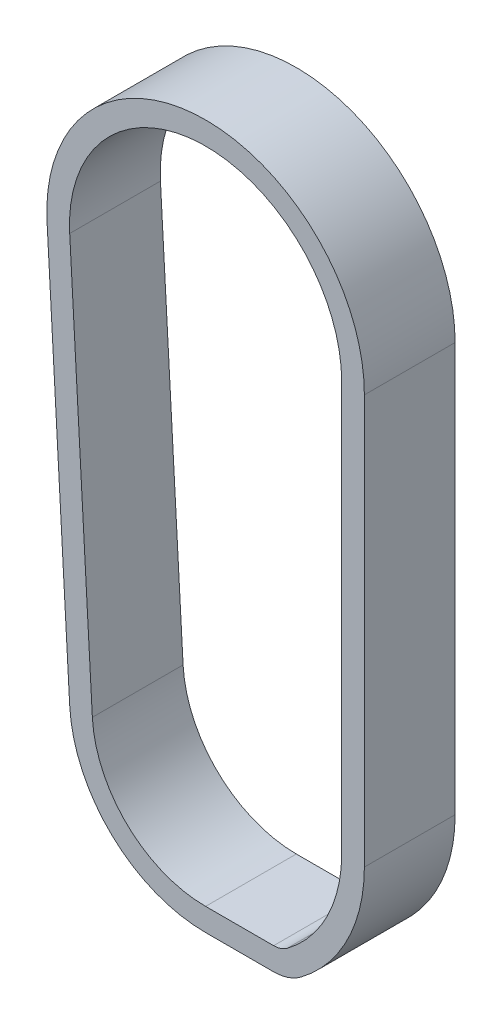
ISO-10303-21;
HEADER;
FILE_DESCRIPTION(('STEP AP214'),'2;1');
FILE_NAME('part.step','',(''),(''),'','','');
FILE_SCHEMA(('AUTOMOTIVE_DESIGN { 1 0 10303 214 1 1 1 1 }'));
ENDSEC;
DATA;
#1=APPLICATION_CONTEXT('core data for automotive mechanical design processes');
#2=APPLICATION_PROTOCOL_DEFINITION('international standard','automotive_design',2000,#1);
#3=PRODUCT_CONTEXT('',#1,'mechanical');
#4=PRODUCT('Part','Part','',(#3));
#5=PRODUCT_RELATED_PRODUCT_CATEGORY('part','',(#4));
#6=PRODUCT_DEFINITION_FORMATION('','',#4);
#7=PRODUCT_DEFINITION_CONTEXT('part definition',#1,'design');
#8=PRODUCT_DEFINITION('design','',#6,#7);
#9=PRODUCT_DEFINITION_SHAPE('','',#8);
#10=(LENGTH_UNIT() NAMED_UNIT(*) SI_UNIT(.MILLI.,.METRE.));
#11=(NAMED_UNIT(*) PLANE_ANGLE_UNIT() SI_UNIT($,.RADIAN.));
#12=(NAMED_UNIT(*) SI_UNIT($,.STERADIAN.) SOLID_ANGLE_UNIT());
#13=UNCERTAINTY_MEASURE_WITH_UNIT(LENGTH_MEASURE(1.E-05),#10,'distance_accuracy_value','');
#14=(GEOMETRIC_REPRESENTATION_CONTEXT(3) GLOBAL_UNCERTAINTY_ASSIGNED_CONTEXT((#13)) GLOBAL_UNIT_ASSIGNED_CONTEXT((#10,
#11,#12)) REPRESENTATION_CONTEXT('',''));
#15=CARTESIAN_POINT('',(0.,0.,0.));
#16=DIRECTION('',(0.,0.,1.));
#17=DIRECTION('',(1.,0.,0.));
#18=AXIS2_PLACEMENT_3D('',#15,#16,#17);
#19=CARTESIAN_POINT('',(0.,-90.14,20.));
#20=DIRECTION('',(0.,0.,1.));
#21=DIRECTION('',(1.,0.,0.));
#22=AXIS2_PLACEMENT_3D('',#19,#20,#21);
#23=PLANE('',#22);
#24=CARTESIAN_POINT('',(0.,-90.14,20.));
#25=DIRECTION('',(0.,0.,1.));
#26=DIRECTION('',(1.,0.,0.));
#27=AXIS2_PLACEMENT_3D('',#24,#25,#26);
#28=CIRCLE('',#27,35.);
#29=CARTESIAN_POINT('',(21.,-118.14,20.));
#30=VERTEX_POINT('',#29);
#31=CARTESIAN_POINT('',(35.,-90.14,20.));
#32=VERTEX_POINT('',#31);
#33=EDGE_CURVE('E192',#30,#32,#28,.T.);
#34=ORIENTED_EDGE('',*,*,#33,.T.);
#35=DIRECTION('',(0.,1.,0.));
#36=VECTOR('',#35,1.);
#37=CARTESIAN_POINT('',(35.,-90.14,20.));
#38=LINE('',#37,#36);
#39=CARTESIAN_POINT('',(35.,-1.54993267934059E-13,20.));
#40=VERTEX_POINT('',#39);
#41=EDGE_CURVE('E195',#32,#40,#38,.T.);
#42=ORIENTED_EDGE('',*,*,#41,.T.);
#43=CARTESIAN_POINT('',(0.,0.,20.));
#44=DIRECTION('',(0.,0.,1.));
#45=DIRECTION('',(1.,0.,0.));
#46=AXIS2_PLACEMENT_3D('',#43,#44,#45);
#47=CIRCLE('',#46,35.);
#48=CARTESIAN_POINT('',(-34.9461138197315,-1.94142445085421,20.));
#49=VERTEX_POINT('',#48);
#50=EDGE_CURVE('E198',#40,#49,#47,.T.);
#51=ORIENTED_EDGE('',*,*,#50,.T.);
#52=DIRECTION('',(0.0554692700244064,-0.99846039484947,0.));
#53=VECTOR('',#52,1.);
#54=CARTESIAN_POINT('',(-34.9461138197315,-1.94142445085422,20.));
#55=LINE('',#54,#53);
#56=CARTESIAN_POINT('',(-29.9538118454841,-91.8040781007322,20.));
#57=VERTEX_POINT('',#56);
#58=EDGE_CURVE('E200',#49,#57,#55,.T.);
#59=ORIENTED_EDGE('',*,*,#58,.T.);
#60=CARTESIAN_POINT('',(0.,-90.14,20.));
#61=DIRECTION('',(0.,0.,1.));
#62=DIRECTION('',(1.,0.,0.));
#63=AXIS2_PLACEMENT_3D('',#60,#61,#62);
#64=CIRCLE('',#63,30.);
#65=CARTESIAN_POINT('',(0.,-120.14,20.));
#66=VERTEX_POINT('',#65);
#67=EDGE_CURVE('E202',#57,#66,#64,.T.);
#68=ORIENTED_EDGE('',*,*,#67,.T.);
#69=DIRECTION('',(1.,0.,0.));
#70=VECTOR('',#69,1.);
#71=CARTESIAN_POINT('',(0.,-120.14,20.));
#72=LINE('',#71,#70);
#73=CARTESIAN_POINT('',(15.,-120.14,20.));
#74=VERTEX_POINT('',#73);
#75=EDGE_CURVE('E204',#66,#74,#72,.T.);
#76=ORIENTED_EDGE('',*,*,#75,.T.);
#77=CARTESIAN_POINT('',(15.,-110.14,20.));
#78=DIRECTION('',(0.,0.,1.));
#79=DIRECTION('',(1.,0.,0.));
#80=AXIS2_PLACEMENT_3D('',#77,#78,#79);
#81=CIRCLE('',#80,9.99999999999999);
#82=EDGE_CURVE('E206',#74,#30,#81,.T.);
#83=ORIENTED_EDGE('',*,*,#82,.T.);
#84=EDGE_LOOP('',(#34,#42,#51,#59,#68,#76,#83));
#85=FACE_BOUND('',#84,.T.);
#86=DIRECTION('',(0.,1.,0.));
#87=VECTOR('',#86,1.);
#88=CARTESIAN_POINT('',(30.,-90.14,20.));
#89=LINE('',#88,#87);
#90=CARTESIAN_POINT('',(30.,-90.14,20.));
#91=VERTEX_POINT('',#90);
#92=CARTESIAN_POINT('',(30.,-1.52655665885959E-13,20.));
#93=VERTEX_POINT('',#92);
#94=EDGE_CURVE('E142',#91,#93,#89,.T.);
#95=ORIENTED_EDGE('',*,*,#94,.F.);
#96=CARTESIAN_POINT('',(0.,-90.14,20.));
#97=DIRECTION('',(0.,0.,1.));
#98=DIRECTION('',(1.,0.,0.));
#99=AXIS2_PLACEMENT_3D('',#96,#97,#98);
#100=CIRCLE('',#99,30.);
#101=CARTESIAN_POINT('',(18.,-114.14,20.));
#102=VERTEX_POINT('',#101);
#103=EDGE_CURVE('E134',#102,#91,#100,.T.);
#104=ORIENTED_EDGE('',*,*,#103,.F.);
#105=CARTESIAN_POINT('',(15.,-110.14,20.));
#106=DIRECTION('',(0.,0.,1.));
#107=DIRECTION('',(1.,0.,0.));
#108=AXIS2_PLACEMENT_3D('',#105,#106,#107);
#109=CIRCLE('',#108,4.99999999999999);
#110=CARTESIAN_POINT('',(15.,-115.14,20.));
#111=VERTEX_POINT('',#110);
#112=EDGE_CURVE('E165',#111,#102,#109,.T.);
#113=ORIENTED_EDGE('',*,*,#112,.F.);
#114=DIRECTION('',(1.,0.,0.));
#115=VECTOR('',#114,1.);
#116=CARTESIAN_POINT('',(0.,-115.14,20.));
#117=LINE('',#116,#115);
#118=CARTESIAN_POINT('',(0.,-115.14,20.));
#119=VERTEX_POINT('',#118);
#120=EDGE_CURVE('E163',#119,#111,#117,.T.);
#121=ORIENTED_EDGE('',*,*,#120,.F.);
#122=CARTESIAN_POINT('',(0.,-90.14,20.));
#123=DIRECTION('',(0.,0.,1.));
#124=DIRECTION('',(1.,0.,0.));
#125=AXIS2_PLACEMENT_3D('',#122,#123,#124);
#126=CIRCLE('',#125,25.);
#127=CARTESIAN_POINT('',(-24.9615098712368,-91.5267317506102,20.));
#128=VERTEX_POINT('',#127);
#129=EDGE_CURVE('E161',#128,#119,#126,.T.);
#130=ORIENTED_EDGE('',*,*,#129,.F.);
#131=DIRECTION('',(0.0554692700244063,-0.99846039484947,0.));
#132=VECTOR('',#131,1.);
#133=CARTESIAN_POINT('',(-29.9538118454841,-1.66407810073218,20.));
#134=LINE('',#133,#132);
#135=CARTESIAN_POINT('',(-29.9538118454841,-1.66407810073218,20.));
#136=VERTEX_POINT('',#135);
#137=EDGE_CURVE('E157',#136,#128,#134,.T.);
#138=ORIENTED_EDGE('',*,*,#137,.F.);
#139=CARTESIAN_POINT('',(0.,0.,20.));
#140=DIRECTION('',(0.,0.,1.));
#141=DIRECTION('',(1.,0.,0.));
#142=AXIS2_PLACEMENT_3D('',#139,#140,#141);
#143=CIRCLE('',#142,30.);
#144=EDGE_CURVE('E155',#93,#136,#143,.T.);
#145=ORIENTED_EDGE('',*,*,#144,.F.);
#146=EDGE_LOOP('',(#95,#104,#113,#121,#130,#138,#145));
#147=FACE_BOUND('',#146,.T.);
#148=ADVANCED_FACE('F33',(#85,#147),#23,.T.);
#149=CARTESIAN_POINT('',(0.,-90.14,0.));
#150=DIRECTION('',(0.,0.,1.));
#151=DIRECTION('',(1.,0.,0.));
#152=AXIS2_PLACEMENT_3D('',#149,#150,#151);
#153=PLANE('',#152);
#154=CARTESIAN_POINT('',(0.,-90.14,0.));
#155=DIRECTION('',(0.,0.,1.));
#156=DIRECTION('',(1.,0.,0.));
#157=AXIS2_PLACEMENT_3D('',#154,#155,#156);
#158=CIRCLE('',#157,35.);
#159=CARTESIAN_POINT('',(21.,-118.14,0.));
#160=VERTEX_POINT('',#159);
#161=CARTESIAN_POINT('',(35.,-90.14,0.));
#162=VERTEX_POINT('',#161);
#163=EDGE_CURVE('E150',#160,#162,#158,.T.);
#164=ORIENTED_EDGE('',*,*,#163,.F.);
#165=CARTESIAN_POINT('',(15.,-110.14,0.));
#166=DIRECTION('',(0.,0.,1.));
#167=DIRECTION('',(1.,0.,0.));
#168=AXIS2_PLACEMENT_3D('',#165,#166,#167);
#169=CIRCLE('',#168,9.99999999999999);
#170=CARTESIAN_POINT('',(15.,-120.14,0.));
#171=VERTEX_POINT('',#170);
#172=EDGE_CURVE('E196',#171,#160,#169,.T.);
#173=ORIENTED_EDGE('',*,*,#172,.F.);
#174=DIRECTION('',(1.,0.,0.));
#175=VECTOR('',#174,1.);
#176=CARTESIAN_POINT('',(0.,-120.14,0.));
#177=LINE('',#176,#175);
#178=CARTESIAN_POINT('',(0.,-120.14,0.));
#179=VERTEX_POINT('',#178);
#180=EDGE_CURVE('E219',#179,#171,#177,.T.);
#181=ORIENTED_EDGE('',*,*,#180,.F.);
#182=CARTESIAN_POINT('',(0.,-90.14,0.));
#183=DIRECTION('',(0.,0.,1.));
#184=DIRECTION('',(1.,0.,0.));
#185=AXIS2_PLACEMENT_3D('',#182,#183,#184);
#186=CIRCLE('',#185,30.);
#187=CARTESIAN_POINT('',(-29.9538118454841,-91.8040781007322,0.));
#188=VERTEX_POINT('',#187);
#189=EDGE_CURVE('E217',#188,#179,#186,.T.);
#190=ORIENTED_EDGE('',*,*,#189,.F.);
#191=DIRECTION('',(0.0554692700244064,-0.99846039484947,0.));
#192=VECTOR('',#191,1.);
#193=CARTESIAN_POINT('',(-34.9461138197315,-1.94142445085422,0.));
#194=LINE('',#193,#192);
#195=CARTESIAN_POINT('',(-34.9461138197315,-1.94142445085421,0.));
#196=VERTEX_POINT('',#195);
#197=EDGE_CURVE('E215',#196,#188,#194,.T.);
#198=ORIENTED_EDGE('',*,*,#197,.F.);
#199=CARTESIAN_POINT('',(0.,0.,0.));
#200=DIRECTION('',(0.,0.,1.));
#201=DIRECTION('',(1.,0.,0.));
#202=AXIS2_PLACEMENT_3D('',#199,#200,#201);
#203=CIRCLE('',#202,35.);
#204=CARTESIAN_POINT('',(35.,-1.54993267934059E-13,0.));
#205=VERTEX_POINT('',#204);
#206=EDGE_CURVE('E213',#205,#196,#203,.T.);
#207=ORIENTED_EDGE('',*,*,#206,.F.);
#208=DIRECTION('',(0.,1.,0.));
#209=VECTOR('',#208,1.);
#210=CARTESIAN_POINT('',(35.,-90.14,0.));
#211=LINE('',#210,#209);
#212=EDGE_CURVE('E211',#162,#205,#211,.T.);
#213=ORIENTED_EDGE('',*,*,#212,.F.);
#214=EDGE_LOOP('',(#164,#173,#181,#190,#198,#207,#213));
#215=FACE_BOUND('',#214,.T.);
#216=CARTESIAN_POINT('',(0.,-90.14,0.));
#217=DIRECTION('',(0.,0.,1.));
#218=DIRECTION('',(1.,0.,0.));
#219=AXIS2_PLACEMENT_3D('',#216,#217,#218);
#220=CIRCLE('',#219,30.);
#221=CARTESIAN_POINT('',(18.,-114.14,0.));
#222=VERTEX_POINT('',#221);
#223=CARTESIAN_POINT('',(30.,-90.14,0.));
#224=VERTEX_POINT('',#223);
#225=EDGE_CURVE('E56',#222,#224,#220,.T.);
#226=ORIENTED_EDGE('',*,*,#225,.T.);
#227=DIRECTION('',(0.,1.,0.));
#228=VECTOR('',#227,1.);
#229=CARTESIAN_POINT('',(30.,-90.14,0.));
#230=LINE('',#229,#228);
#231=CARTESIAN_POINT('',(30.,-1.52655665885959E-13,0.));
#232=VERTEX_POINT('',#231);
#233=EDGE_CURVE('E149',#224,#232,#230,.T.);
#234=ORIENTED_EDGE('',*,*,#233,.T.);
#235=CARTESIAN_POINT('',(0.,0.,0.));
#236=DIRECTION('',(0.,0.,1.));
#237=DIRECTION('',(1.,0.,0.));
#238=AXIS2_PLACEMENT_3D('',#235,#236,#237);
#239=CIRCLE('',#238,30.);
#240=CARTESIAN_POINT('',(-29.9538118454841,-1.66407810073218,0.));
#241=VERTEX_POINT('',#240);
#242=EDGE_CURVE('E169',#232,#241,#239,.T.);
#243=ORIENTED_EDGE('',*,*,#242,.T.);
#244=DIRECTION('',(0.0554692700244063,-0.99846039484947,0.));
#245=VECTOR('',#244,1.);
#246=CARTESIAN_POINT('',(-29.9538118454841,-1.66407810073218,0.));
#247=LINE('',#246,#245);
#248=CARTESIAN_POINT('',(-24.9615098712368,-91.5267317506102,0.));
#249=VERTEX_POINT('',#248);
#250=EDGE_CURVE('E172',#241,#249,#247,.T.);
#251=ORIENTED_EDGE('',*,*,#250,.T.);
#252=CARTESIAN_POINT('',(0.,-90.14,0.));
#253=DIRECTION('',(0.,0.,1.));
#254=DIRECTION('',(1.,0.,0.));
#255=AXIS2_PLACEMENT_3D('',#252,#253,#254);
#256=CIRCLE('',#255,25.);
#257=CARTESIAN_POINT('',(0.,-115.14,0.));
#258=VERTEX_POINT('',#257);
#259=EDGE_CURVE('E175',#249,#258,#256,.T.);
#260=ORIENTED_EDGE('',*,*,#259,.T.);
#261=DIRECTION('',(1.,0.,0.));
#262=VECTOR('',#261,1.);
#263=CARTESIAN_POINT('',(0.,-115.14,0.));
#264=LINE('',#263,#262);
#265=CARTESIAN_POINT('',(15.,-115.14,0.));
#266=VERTEX_POINT('',#265);
#267=EDGE_CURVE('E178',#258,#266,#264,.T.);
#268=ORIENTED_EDGE('',*,*,#267,.T.);
#269=CARTESIAN_POINT('',(15.,-110.14,0.));
#270=DIRECTION('',(0.,0.,1.));
#271=DIRECTION('',(1.,0.,0.));
#272=AXIS2_PLACEMENT_3D('',#269,#270,#271);
#273=CIRCLE('',#272,4.99999999999999);
#274=EDGE_CURVE('E143',#266,#222,#273,.T.);
#275=ORIENTED_EDGE('',*,*,#274,.T.);
#276=EDGE_LOOP('',(#226,#234,#243,#251,#260,#268,#275));
#277=FACE_BOUND('',#276,.T.);
#278=ADVANCED_FACE('F246',(#215,#277),#153,.F.);
#279=CARTESIAN_POINT('',(0.,-90.14,20.));
#280=DIRECTION('',(0.,0.,-1.));
#281=DIRECTION('',(-1.,0.,0.));
#282=AXIS2_PLACEMENT_3D('',#279,#280,#281);
#283=CYLINDRICAL_SURFACE('',#282,35.);
#284=ORIENTED_EDGE('',*,*,#163,.T.);
#285=DIRECTION('',(0.,0.,-1.));
#286=VECTOR('',#285,1.);
#287=CARTESIAN_POINT('',(35.,-90.14,20.));
#288=LINE('',#287,#286);
#289=EDGE_CURVE('E11',#32,#162,#288,.T.);
#290=ORIENTED_EDGE('',*,*,#289,.F.);
#291=ORIENTED_EDGE('',*,*,#33,.F.);
#292=DIRECTION('',(0.,0.,-1.));
#293=VECTOR('',#292,1.);
#294=CARTESIAN_POINT('',(21.,-118.14,20.));
#295=LINE('',#294,#293);
#296=EDGE_CURVE('E208',#30,#160,#295,.T.);
#297=ORIENTED_EDGE('',*,*,#296,.T.);
#298=EDGE_LOOP('',(#284,#290,#291,#297));
#299=FACE_BOUND('',#298,.T.);
#300=ADVANCED_FACE('F35',(#299),#283,.T.);
#301=CARTESIAN_POINT('',(35.,-90.14,20.));
#302=DIRECTION('',(-1.,0.,0.));
#303=DIRECTION('',(0.,-1.,0.));
#304=AXIS2_PLACEMENT_3D('',#301,#302,#303);
#305=PLANE('',#304);
#306=ORIENTED_EDGE('',*,*,#212,.T.);
#307=DIRECTION('',(0.,0.,-1.));
#308=VECTOR('',#307,1.);
#309=CARTESIAN_POINT('',(35.,-1.54993267934059E-13,20.));
#310=LINE('',#309,#308);
#311=EDGE_CURVE('E41',#40,#205,#310,.T.);
#312=ORIENTED_EDGE('',*,*,#311,.F.);
#313=ORIENTED_EDGE('',*,*,#41,.F.);
#314=ORIENTED_EDGE('',*,*,#289,.T.);
#315=EDGE_LOOP('',(#306,#312,#313,#314));
#316=FACE_BOUND('',#315,.T.);
#317=ADVANCED_FACE('F263',(#316),#305,.F.);
#318=CARTESIAN_POINT('',(0.,0.,20.));
#319=DIRECTION('',(0.,0.,-1.));
#320=DIRECTION('',(-1.,0.,0.));
#321=AXIS2_PLACEMENT_3D('',#318,#319,#320);
#322=CYLINDRICAL_SURFACE('',#321,35.);
#323=ORIENTED_EDGE('',*,*,#206,.T.);
#324=DIRECTION('',(0.,0.,-1.));
#325=VECTOR('',#324,1.);
#326=CARTESIAN_POINT('',(-34.9461138197315,-1.94142445085421,20.));
#327=LINE('',#326,#325);
#328=EDGE_CURVE('E233',#49,#196,#327,.T.);
#329=ORIENTED_EDGE('',*,*,#328,.F.);
#330=ORIENTED_EDGE('',*,*,#50,.F.);
#331=ORIENTED_EDGE('',*,*,#311,.T.);
#332=EDGE_LOOP('',(#323,#329,#330,#331));
#333=FACE_BOUND('',#332,.T.);
#334=ADVANCED_FACE('F240',(#333),#322,.T.);
#335=CARTESIAN_POINT('',(-34.9461138197315,-1.94142445085422,20.));
#336=DIRECTION('',(0.99846039484947,0.0554692700244064,0.));
#337=DIRECTION('',(-0.0554692700244064,0.99846039484947,0.));
#338=AXIS2_PLACEMENT_3D('',#335,#336,#337);
#339=PLANE('',#338);
#340=ORIENTED_EDGE('',*,*,#197,.T.);
#341=DIRECTION('',(0.,0.,-1.));
#342=VECTOR('',#341,1.);
#343=CARTESIAN_POINT('',(-29.9538118454841,-91.8040781007322,20.));
#344=LINE('',#343,#342);
#345=EDGE_CURVE('E230',#57,#188,#344,.T.);
#346=ORIENTED_EDGE('',*,*,#345,.F.);
#347=ORIENTED_EDGE('',*,*,#58,.F.);
#348=ORIENTED_EDGE('',*,*,#328,.T.);
#349=EDGE_LOOP('',(#340,#346,#347,#348));
#350=FACE_BOUND('',#349,.T.);
#351=ADVANCED_FACE('F252',(#350),#339,.F.);
#352=CARTESIAN_POINT('',(0.,-90.14,20.));
#353=DIRECTION('',(0.,0.,-1.));
#354=DIRECTION('',(-1.,0.,0.));
#355=AXIS2_PLACEMENT_3D('',#352,#353,#354);
#356=CYLINDRICAL_SURFACE('',#355,30.);
#357=ORIENTED_EDGE('',*,*,#189,.T.);
#358=DIRECTION('',(0.,0.,-1.));
#359=VECTOR('',#358,1.);
#360=CARTESIAN_POINT('',(0.,-120.14,20.));
#361=LINE('',#360,#359);
#362=EDGE_CURVE('E227',#66,#179,#361,.T.);
#363=ORIENTED_EDGE('',*,*,#362,.F.);
#364=ORIENTED_EDGE('',*,*,#67,.F.);
#365=ORIENTED_EDGE('',*,*,#345,.T.);
#366=EDGE_LOOP('',(#357,#363,#364,#365));
#367=FACE_BOUND('',#366,.T.);
#368=ADVANCED_FACE('F256',(#367),#356,.T.);
#369=CARTESIAN_POINT('',(0.,-120.14,20.));
#370=DIRECTION('',(0.,1.,0.));
#371=DIRECTION('',(0.,0.,1.));
#372=AXIS2_PLACEMENT_3D('',#369,#370,#371);
#373=PLANE('',#372);
#374=ORIENTED_EDGE('',*,*,#180,.T.);
#375=DIRECTION('',(0.,0.,-1.));
#376=VECTOR('',#375,1.);
#377=CARTESIAN_POINT('',(15.,-120.14,20.));
#378=LINE('',#377,#376);
#379=EDGE_CURVE('E224',#74,#171,#378,.T.);
#380=ORIENTED_EDGE('',*,*,#379,.F.);
#381=ORIENTED_EDGE('',*,*,#75,.F.);
#382=ORIENTED_EDGE('',*,*,#362,.T.);
#383=EDGE_LOOP('',(#374,#380,#381,#382));
#384=FACE_BOUND('',#383,.T.);
#385=ADVANCED_FACE('F271',(#384),#373,.F.);
#386=CARTESIAN_POINT('',(15.,-110.14,20.));
#387=DIRECTION('',(0.,0.,-1.));
#388=DIRECTION('',(-1.,0.,0.));
#389=AXIS2_PLACEMENT_3D('',#386,#387,#388);
#390=CYLINDRICAL_SURFACE('',#389,9.99999999999999);
#391=ORIENTED_EDGE('',*,*,#172,.T.);
#392=ORIENTED_EDGE('',*,*,#296,.F.);
#393=ORIENTED_EDGE('',*,*,#82,.F.);
#394=ORIENTED_EDGE('',*,*,#379,.T.);
#395=EDGE_LOOP('',(#391,#392,#393,#394));
#396=FACE_BOUND('',#395,.T.);
#397=ADVANCED_FACE('F268',(#396),#390,.T.);
#398=CARTESIAN_POINT('',(0.,-90.14,20.));
#399=DIRECTION('',(0.,0.,-1.));
#400=DIRECTION('',(-1.,0.,0.));
#401=AXIS2_PLACEMENT_3D('',#398,#399,#400);
#402=CYLINDRICAL_SURFACE('',#401,30.);
#403=ORIENTED_EDGE('',*,*,#225,.F.);
#404=DIRECTION('',(0.,0.,-1.));
#405=VECTOR('',#404,1.);
#406=CARTESIAN_POINT('',(18.,-114.14,20.));
#407=LINE('',#406,#405);
#408=EDGE_CURVE('E138',#102,#222,#407,.T.);
#409=ORIENTED_EDGE('',*,*,#408,.F.);
#410=ORIENTED_EDGE('',*,*,#103,.T.);
#411=DIRECTION('',(0.,0.,-1.));
#412=VECTOR('',#411,1.);
#413=CARTESIAN_POINT('',(30.,-90.14,20.));
#414=LINE('',#413,#412);
#415=EDGE_CURVE('E137',#91,#224,#414,.T.);
#416=ORIENTED_EDGE('',*,*,#415,.T.);
#417=EDGE_LOOP('',(#403,#409,#410,#416));
#418=FACE_BOUND('',#417,.T.);
#419=ADVANCED_FACE('F136',(#418),#402,.F.);
#420=CARTESIAN_POINT('',(30.,-90.14,20.));
#421=DIRECTION('',(-1.,0.,0.));
#422=DIRECTION('',(0.,0.,1.));
#423=AXIS2_PLACEMENT_3D('',#420,#421,#422);
#424=PLANE('',#423);
#425=ORIENTED_EDGE('',*,*,#233,.F.);
#426=ORIENTED_EDGE('',*,*,#415,.F.);
#427=ORIENTED_EDGE('',*,*,#94,.T.);
#428=DIRECTION('',(0.,0.,-1.));
#429=VECTOR('',#428,1.);
#430=CARTESIAN_POINT('',(30.,-1.52655665885959E-13,20.));
#431=LINE('',#430,#429);
#432=EDGE_CURVE('E151',#93,#232,#431,.T.);
#433=ORIENTED_EDGE('',*,*,#432,.T.);
#434=EDGE_LOOP('',(#425,#426,#427,#433));
#435=FACE_BOUND('',#434,.T.);
#436=ADVANCED_FACE('F146',(#435),#424,.T.);
#437=CARTESIAN_POINT('',(0.,0.,20.));
#438=DIRECTION('',(0.,0.,-1.));
#439=DIRECTION('',(-1.,0.,0.));
#440=AXIS2_PLACEMENT_3D('',#437,#438,#439);
#441=CYLINDRICAL_SURFACE('',#440,30.);
#442=ORIENTED_EDGE('',*,*,#242,.F.);
#443=ORIENTED_EDGE('',*,*,#432,.F.);
#444=ORIENTED_EDGE('',*,*,#144,.T.);
#445=DIRECTION('',(0.,0.,-1.));
#446=VECTOR('',#445,1.);
#447=CARTESIAN_POINT('',(-29.9538118454841,-1.66407810073218,20.));
#448=LINE('',#447,#446);
#449=EDGE_CURVE('E189',#136,#241,#448,.T.);
#450=ORIENTED_EDGE('',*,*,#449,.T.);
#451=EDGE_LOOP('',(#442,#443,#444,#450));
#452=FACE_BOUND('',#451,.T.);
#453=ADVANCED_FACE('F291',(#452),#441,.F.);
#454=CARTESIAN_POINT('',(-29.9538118454841,-1.66407810073218,20.));
#455=DIRECTION('',(0.99846039484947,0.0554692700244063,0.));
#456=DIRECTION('',(-0.0554692700244063,0.99846039484947,0.));
#457=AXIS2_PLACEMENT_3D('',#454,#455,#456);
#458=PLANE('',#457);
#459=ORIENTED_EDGE('',*,*,#250,.F.);
#460=ORIENTED_EDGE('',*,*,#449,.F.);
#461=ORIENTED_EDGE('',*,*,#137,.T.);
#462=DIRECTION('',(0.,0.,-1.));
#463=VECTOR('',#462,1.);
#464=CARTESIAN_POINT('',(-24.9615098712368,-91.5267317506102,20.));
#465=LINE('',#464,#463);
#466=EDGE_CURVE('E187',#128,#249,#465,.T.);
#467=ORIENTED_EDGE('',*,*,#466,.T.);
#468=EDGE_LOOP('',(#459,#460,#461,#467));
#469=FACE_BOUND('',#468,.T.);
#470=ADVANCED_FACE('F294',(#469),#458,.T.);
#471=CARTESIAN_POINT('',(0.,-90.14,20.));
#472=DIRECTION('',(0.,0.,-1.));
#473=DIRECTION('',(-1.,0.,0.));
#474=AXIS2_PLACEMENT_3D('',#471,#472,#473);
#475=CYLINDRICAL_SURFACE('',#474,25.);
#476=ORIENTED_EDGE('',*,*,#259,.F.);
#477=ORIENTED_EDGE('',*,*,#466,.F.);
#478=ORIENTED_EDGE('',*,*,#129,.T.);
#479=DIRECTION('',(0.,0.,-1.));
#480=VECTOR('',#479,1.);
#481=CARTESIAN_POINT('',(0.,-115.14,20.));
#482=LINE('',#481,#480);
#483=EDGE_CURVE('E185',#119,#258,#482,.T.);
#484=ORIENTED_EDGE('',*,*,#483,.T.);
#485=EDGE_LOOP('',(#476,#477,#478,#484));
#486=FACE_BOUND('',#485,.T.);
#487=ADVANCED_FACE('F298',(#486),#475,.F.);
#488=CARTESIAN_POINT('',(0.,-115.14,20.));
#489=DIRECTION('',(0.,1.,0.));
#490=DIRECTION('',(-1.,0.,0.));
#491=AXIS2_PLACEMENT_3D('',#488,#489,#490);
#492=PLANE('',#491);
#493=ORIENTED_EDGE('',*,*,#267,.F.);
#494=ORIENTED_EDGE('',*,*,#483,.F.);
#495=ORIENTED_EDGE('',*,*,#120,.T.);
#496=DIRECTION('',(0.,0.,-1.));
#497=VECTOR('',#496,1.);
#498=CARTESIAN_POINT('',(15.,-115.14,20.));
#499=LINE('',#498,#497);
#500=EDGE_CURVE('E48',#111,#266,#499,.T.);
#501=ORIENTED_EDGE('',*,*,#500,.T.);
#502=EDGE_LOOP('',(#493,#494,#495,#501));
#503=FACE_BOUND('',#502,.T.);
#504=ADVANCED_FACE('F302',(#503),#492,.T.);
#505=CARTESIAN_POINT('',(15.,-110.14,20.));
#506=DIRECTION('',(0.,0.,-1.));
#507=DIRECTION('',(-1.,0.,0.));
#508=AXIS2_PLACEMENT_3D('',#505,#506,#507);
#509=CYLINDRICAL_SURFACE('',#508,4.99999999999999);
#510=ORIENTED_EDGE('',*,*,#274,.F.);
#511=ORIENTED_EDGE('',*,*,#500,.F.);
#512=ORIENTED_EDGE('',*,*,#112,.T.);
#513=ORIENTED_EDGE('',*,*,#408,.T.);
#514=EDGE_LOOP('',(#510,#511,#512,#513));
#515=FACE_BOUND('',#514,.T.);
#516=ADVANCED_FACE('F306',(#515),#509,.F.);
#517=CLOSED_SHELL('',(#148,#278,#300,#317,#334,#351,#368,#385,#397,#419,#436,#453,#470,#487,
#504,#516));
#518=MANIFOLD_SOLID_BREP('B2',#517);
#519=ADVANCED_BREP_SHAPE_REPRESENTATION('',(#18,#518),#14);
#520=SHAPE_DEFINITION_REPRESENTATION(#9,#519);
ENDSEC;
END-ISO-10303-21;
